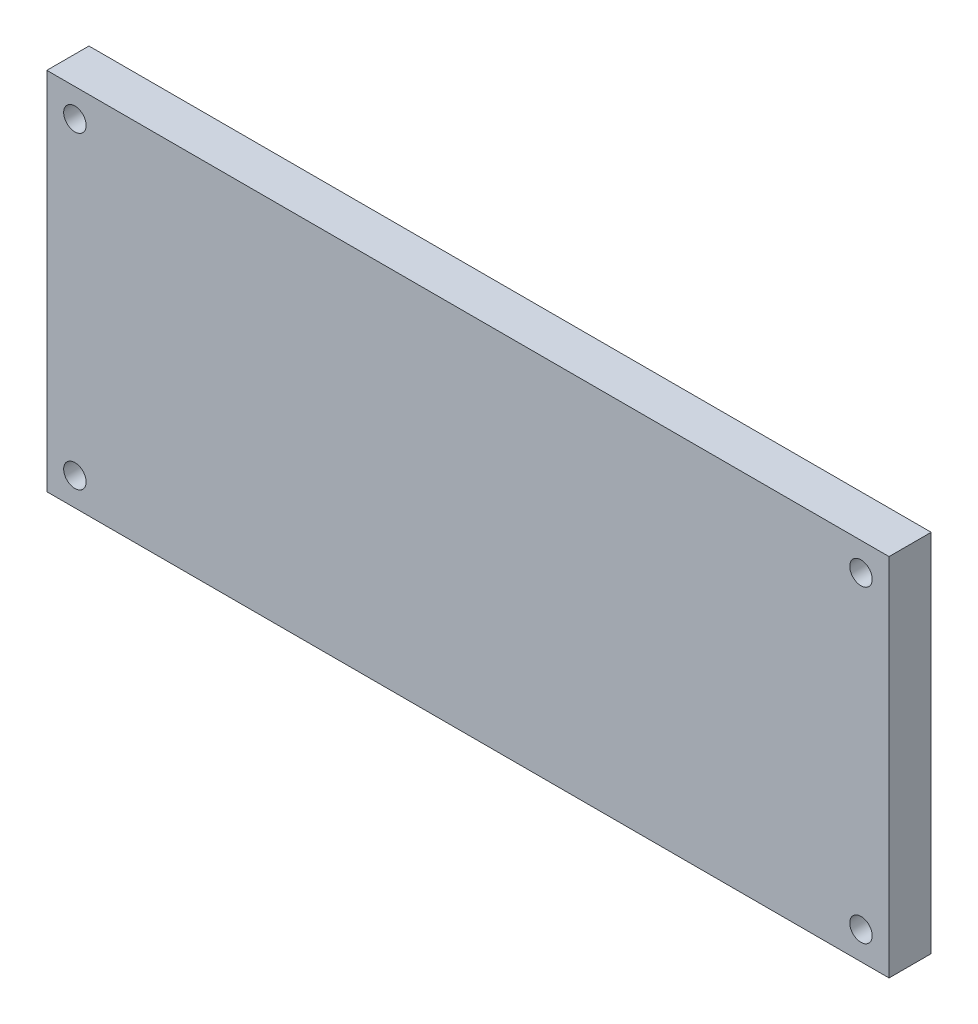
ISO-10303-21;
HEADER;
FILE_DESCRIPTION(('STEP AP214'),'2;1');
FILE_NAME('part.step','',(''),(''),'','','');
FILE_SCHEMA(('AUTOMOTIVE_DESIGN { 1 0 10303 214 1 1 1 1 }'));
ENDSEC;
DATA;
#1=APPLICATION_CONTEXT('core data for automotive mechanical design processes');
#2=APPLICATION_PROTOCOL_DEFINITION('international standard','automotive_design',2000,#1);
#3=PRODUCT_CONTEXT('',#1,'mechanical');
#4=PRODUCT('Part','Part','',(#3));
#5=PRODUCT_RELATED_PRODUCT_CATEGORY('part','',(#4));
#6=PRODUCT_DEFINITION_FORMATION('','',#4);
#7=PRODUCT_DEFINITION_CONTEXT('part definition',#1,'design');
#8=PRODUCT_DEFINITION('design','',#6,#7);
#9=PRODUCT_DEFINITION_SHAPE('','',#8);
#10=(LENGTH_UNIT() NAMED_UNIT(*) SI_UNIT(.MILLI.,.METRE.));
#11=(NAMED_UNIT(*) PLANE_ANGLE_UNIT() SI_UNIT($,.RADIAN.));
#12=(NAMED_UNIT(*) SI_UNIT($,.STERADIAN.) SOLID_ANGLE_UNIT());
#13=UNCERTAINTY_MEASURE_WITH_UNIT(LENGTH_MEASURE(1.E-05),#10,'distance_accuracy_value','');
#14=(GEOMETRIC_REPRESENTATION_CONTEXT(3) GLOBAL_UNCERTAINTY_ASSIGNED_CONTEXT((#13)) GLOBAL_UNIT_ASSIGNED_CONTEXT((#10,
#11,#12)) REPRESENTATION_CONTEXT('',''));
#15=CARTESIAN_POINT('',(0.,0.,0.));
#16=DIRECTION('',(0.,0.,1.));
#17=DIRECTION('',(1.,0.,0.));
#18=AXIS2_PLACEMENT_3D('',#15,#16,#17);
#19=CARTESIAN_POINT('',(-393.802731112973,130.,15.));
#20=DIRECTION('',(1.,0.,0.));
#21=DIRECTION('',(0.,0.,-1.));
#22=AXIS2_PLACEMENT_3D('',#19,#20,#21);
#23=PLANE('',#22);
#24=DIRECTION('',(0.,-1.,0.));
#25=VECTOR('',#24,1.);
#26=CARTESIAN_POINT('',(-393.802731112973,130.,0.));
#27=LINE('',#26,#25);
#28=CARTESIAN_POINT('',(-393.802731112973,130.,0.));
#29=VERTEX_POINT('',#28);
#30=CARTESIAN_POINT('',(-393.802731112973,0.,0.));
#31=VERTEX_POINT('',#30);
#32=EDGE_CURVE('E96',#29,#31,#27,.T.);
#33=ORIENTED_EDGE('',*,*,#32,.T.);
#34=DIRECTION('',(0.,0.,-1.));
#35=VECTOR('',#34,1.);
#36=CARTESIAN_POINT('',(-393.802731112973,0.,15.));
#37=LINE('',#36,#35);
#38=CARTESIAN_POINT('',(-393.802731112973,0.,15.));
#39=VERTEX_POINT('',#38);
#40=EDGE_CURVE('E11',#39,#31,#37,.T.);
#41=ORIENTED_EDGE('',*,*,#40,.F.);
#42=DIRECTION('',(0.,-1.,0.));
#43=VECTOR('',#42,1.);
#44=CARTESIAN_POINT('',(-393.802731112973,130.,15.));
#45=LINE('',#44,#43);
#46=CARTESIAN_POINT('',(-393.802731112973,130.,15.));
#47=VERTEX_POINT('',#46);
#48=EDGE_CURVE('E84',#47,#39,#45,.T.);
#49=ORIENTED_EDGE('',*,*,#48,.F.);
#50=DIRECTION('',(0.,0.,-1.));
#51=VECTOR('',#50,1.);
#52=CARTESIAN_POINT('',(-393.802731112973,130.,15.));
#53=LINE('',#52,#51);
#54=EDGE_CURVE('E92',#47,#29,#53,.T.);
#55=ORIENTED_EDGE('',*,*,#54,.T.);
#56=EDGE_LOOP('',(#33,#41,#49,#55));
#57=FACE_BOUND('',#56,.T.);
#58=ADVANCED_FACE('F33',(#57),#23,.F.);
#59=CARTESIAN_POINT('',(-393.802731112973,0.,15.));
#60=DIRECTION('',(0.,1.,0.));
#61=DIRECTION('',(0.,0.,1.));
#62=AXIS2_PLACEMENT_3D('',#59,#60,#61);
#63=PLANE('',#62);
#64=DIRECTION('',(1.,0.,0.));
#65=VECTOR('',#64,1.);
#66=CARTESIAN_POINT('',(-393.802731112973,0.,0.));
#67=LINE('',#66,#65);
#68=CARTESIAN_POINT('',(-93.8027311129733,0.,0.));
#69=VERTEX_POINT('',#68);
#70=EDGE_CURVE('E88',#31,#69,#67,.T.);
#71=ORIENTED_EDGE('',*,*,#70,.T.);
#72=DIRECTION('',(0.,0.,-1.));
#73=VECTOR('',#72,1.);
#74=CARTESIAN_POINT('',(-93.8027311129733,0.,15.));
#75=LINE('',#74,#73);
#76=CARTESIAN_POINT('',(-93.8027311129733,0.,15.));
#77=VERTEX_POINT('',#76);
#78=EDGE_CURVE('E41',#77,#69,#75,.T.);
#79=ORIENTED_EDGE('',*,*,#78,.F.);
#80=DIRECTION('',(1.,0.,0.));
#81=VECTOR('',#80,1.);
#82=CARTESIAN_POINT('',(-393.802731112973,0.,15.));
#83=LINE('',#82,#81);
#84=EDGE_CURVE('E79',#39,#77,#83,.T.);
#85=ORIENTED_EDGE('',*,*,#84,.F.);
#86=ORIENTED_EDGE('',*,*,#40,.T.);
#87=EDGE_LOOP('',(#71,#79,#85,#86));
#88=FACE_BOUND('',#87,.T.);
#89=ADVANCED_FACE('F87',(#88),#63,.F.);
#90=CARTESIAN_POINT('',(-93.8027311129733,0.,15.));
#91=DIRECTION('',(-1.,0.,0.));
#92=DIRECTION('',(0.,-1.,0.));
#93=AXIS2_PLACEMENT_3D('',#90,#91,#92);
#94=PLANE('',#93);
#95=DIRECTION('',(0.,1.,0.));
#96=VECTOR('',#95,1.);
#97=CARTESIAN_POINT('',(-93.8027311129733,0.,0.));
#98=LINE('',#97,#96);
#99=CARTESIAN_POINT('',(-93.8027311129733,130.,0.));
#100=VERTEX_POINT('',#99);
#101=EDGE_CURVE('E66',#69,#100,#98,.T.);
#102=ORIENTED_EDGE('',*,*,#101,.T.);
#103=DIRECTION('',(0.,0.,-1.));
#104=VECTOR('',#103,1.);
#105=CARTESIAN_POINT('',(-93.8027311129733,130.,15.));
#106=LINE('',#105,#104);
#107=CARTESIAN_POINT('',(-93.8027311129733,130.,15.));
#108=VERTEX_POINT('',#107);
#109=EDGE_CURVE('E89',#108,#100,#106,.T.);
#110=ORIENTED_EDGE('',*,*,#109,.F.);
#111=DIRECTION('',(0.,1.,0.));
#112=VECTOR('',#111,1.);
#113=CARTESIAN_POINT('',(-93.8027311129733,0.,15.));
#114=LINE('',#113,#112);
#115=EDGE_CURVE('E82',#77,#108,#114,.T.);
#116=ORIENTED_EDGE('',*,*,#115,.F.);
#117=ORIENTED_EDGE('',*,*,#78,.T.);
#118=EDGE_LOOP('',(#102,#110,#116,#117));
#119=FACE_BOUND('',#118,.T.);
#120=ADVANCED_FACE('F90',(#119),#94,.F.);
#121=CARTESIAN_POINT('',(-93.8027311129733,130.,15.));
#122=DIRECTION('',(0.,-1.,0.));
#123=DIRECTION('',(0.,0.,-1.));
#124=AXIS2_PLACEMENT_3D('',#121,#122,#123);
#125=PLANE('',#124);
#126=DIRECTION('',(-1.,0.,0.));
#127=VECTOR('',#126,1.);
#128=CARTESIAN_POINT('',(-93.8027311129733,130.,0.));
#129=LINE('',#128,#127);
#130=EDGE_CURVE('E72',#100,#29,#129,.T.);
#131=ORIENTED_EDGE('',*,*,#130,.T.);
#132=ORIENTED_EDGE('',*,*,#54,.F.);
#133=DIRECTION('',(-1.,0.,0.));
#134=VECTOR('',#133,1.);
#135=CARTESIAN_POINT('',(-93.8027311129733,130.,15.));
#136=LINE('',#135,#134);
#137=EDGE_CURVE('E49',#108,#47,#136,.T.);
#138=ORIENTED_EDGE('',*,*,#137,.F.);
#139=ORIENTED_EDGE('',*,*,#109,.T.);
#140=EDGE_LOOP('',(#131,#132,#138,#139));
#141=FACE_BOUND('',#140,.T.);
#142=ADVANCED_FACE('F104',(#141),#125,.F.);
#143=CARTESIAN_POINT('',(0.,0.,15.));
#144=DIRECTION('',(0.,0.,1.));
#145=DIRECTION('',(1.,0.,0.));
#146=AXIS2_PLACEMENT_3D('',#143,#144,#145);
#147=PLANE('',#146);
#148=CARTESIAN_POINT('',(-383.802731112973,9.99999999999999,15.));
#149=DIRECTION('',(0.,0.,-1.));
#150=DIRECTION('',(-1.,0.,0.));
#151=AXIS2_PLACEMENT_3D('',#148,#149,#150);
#152=CIRCLE('',#151,3.99999999999999);
#153=CARTESIAN_POINT('',(-387.802731112973,9.99999999999999,15.));
#154=VERTEX_POINT('',#153);
#155=EDGE_CURVE('E125',#154,#154,#152,.T.);
#156=ORIENTED_EDGE('',*,*,#155,.T.);
#157=EDGE_LOOP('',(#156));
#158=FACE_BOUND('',#157,.T.);
#159=CARTESIAN_POINT('',(-103.802731112973,120.,15.));
#160=DIRECTION('',(0.,0.,-1.));
#161=DIRECTION('',(-1.,0.,0.));
#162=AXIS2_PLACEMENT_3D('',#159,#160,#161);
#163=CIRCLE('',#162,4.00000000000001);
#164=CARTESIAN_POINT('',(-107.802731112973,120.,15.));
#165=VERTEX_POINT('',#164);
#166=EDGE_CURVE('E119',#165,#165,#163,.T.);
#167=ORIENTED_EDGE('',*,*,#166,.T.);
#168=EDGE_LOOP('',(#167));
#169=FACE_BOUND('',#168,.T.);
#170=CARTESIAN_POINT('',(-103.802731112973,10.,15.));
#171=DIRECTION('',(0.,0.,1.));
#172=DIRECTION('',(1.,0.,0.));
#173=AXIS2_PLACEMENT_3D('',#170,#171,#172);
#174=CIRCLE('',#173,4.00000000000001);
#175=CARTESIAN_POINT('',(-99.8027311129733,10.,15.));
#176=VERTEX_POINT('',#175);
#177=EDGE_CURVE('E116',#176,#176,#174,.T.);
#178=ORIENTED_EDGE('',*,*,#177,.F.);
#179=EDGE_LOOP('',(#178));
#180=FACE_BOUND('',#179,.T.);
#181=CARTESIAN_POINT('',(-383.802731112973,120.,15.));
#182=DIRECTION('',(0.,0.,1.));
#183=DIRECTION('',(1.,0.,0.));
#184=AXIS2_PLACEMENT_3D('',#181,#182,#183);
#185=CIRCLE('',#184,3.99999999999999);
#186=CARTESIAN_POINT('',(-379.802731112973,120.,15.));
#187=VERTEX_POINT('',#186);
#188=EDGE_CURVE('E110',#187,#187,#185,.T.);
#189=ORIENTED_EDGE('',*,*,#188,.F.);
#190=EDGE_LOOP('',(#189));
#191=FACE_BOUND('',#190,.T.);
#192=ORIENTED_EDGE('',*,*,#48,.T.);
#193=ORIENTED_EDGE('',*,*,#84,.T.);
#194=ORIENTED_EDGE('',*,*,#115,.T.);
#195=ORIENTED_EDGE('',*,*,#137,.T.);
#196=EDGE_LOOP('',(#192,#193,#194,#195));
#197=FACE_BOUND('',#196,.T.);
#198=ADVANCED_FACE('F80',(#158,#169,#180,#191,#197),#147,.T.);
#199=CARTESIAN_POINT('',(0.,0.,0.));
#200=DIRECTION('',(0.,0.,1.));
#201=DIRECTION('',(1.,0.,0.));
#202=AXIS2_PLACEMENT_3D('',#199,#200,#201);
#203=PLANE('',#202);
#204=CARTESIAN_POINT('',(-383.802731112973,9.99999999999999,0.));
#205=DIRECTION('',(0.,0.,-1.));
#206=DIRECTION('',(-1.,0.,0.));
#207=AXIS2_PLACEMENT_3D('',#204,#205,#206);
#208=CIRCLE('',#207,3.99999999999999);
#209=CARTESIAN_POINT('',(-387.802731112973,9.99999999999999,0.));
#210=VERTEX_POINT('',#209);
#211=EDGE_CURVE('E128',#210,#210,#208,.T.);
#212=ORIENTED_EDGE('',*,*,#211,.F.);
#213=EDGE_LOOP('',(#212));
#214=FACE_BOUND('',#213,.T.);
#215=CARTESIAN_POINT('',(-103.802731112973,120.,0.));
#216=DIRECTION('',(0.,0.,-1.));
#217=DIRECTION('',(-1.,0.,0.));
#218=AXIS2_PLACEMENT_3D('',#215,#216,#217);
#219=CIRCLE('',#218,4.00000000000001);
#220=CARTESIAN_POINT('',(-107.802731112973,120.,0.));
#221=VERTEX_POINT('',#220);
#222=EDGE_CURVE('E122',#221,#221,#219,.T.);
#223=ORIENTED_EDGE('',*,*,#222,.F.);
#224=EDGE_LOOP('',(#223));
#225=FACE_BOUND('',#224,.T.);
#226=CARTESIAN_POINT('',(-103.802731112973,10.,0.));
#227=DIRECTION('',(0.,0.,1.));
#228=DIRECTION('',(1.,0.,0.));
#229=AXIS2_PLACEMENT_3D('',#226,#227,#228);
#230=CIRCLE('',#229,4.00000000000001);
#231=CARTESIAN_POINT('',(-99.8027311129733,10.,0.));
#232=VERTEX_POINT('',#231);
#233=EDGE_CURVE('E113',#232,#232,#230,.T.);
#234=ORIENTED_EDGE('',*,*,#233,.T.);
#235=EDGE_LOOP('',(#234));
#236=FACE_BOUND('',#235,.T.);
#237=CARTESIAN_POINT('',(-383.802731112973,120.,0.));
#238=DIRECTION('',(0.,0.,1.));
#239=DIRECTION('',(1.,0.,0.));
#240=AXIS2_PLACEMENT_3D('',#237,#238,#239);
#241=CIRCLE('',#240,3.99999999999999);
#242=CARTESIAN_POINT('',(-379.802731112973,120.,0.));
#243=VERTEX_POINT('',#242);
#244=EDGE_CURVE('E99',#243,#243,#241,.T.);
#245=ORIENTED_EDGE('',*,*,#244,.T.);
#246=EDGE_LOOP('',(#245));
#247=FACE_BOUND('',#246,.T.);
#248=ORIENTED_EDGE('',*,*,#32,.F.);
#249=ORIENTED_EDGE('',*,*,#130,.F.);
#250=ORIENTED_EDGE('',*,*,#101,.F.);
#251=ORIENTED_EDGE('',*,*,#70,.F.);
#252=EDGE_LOOP('',(#248,#249,#250,#251));
#253=FACE_BOUND('',#252,.T.);
#254=ADVANCED_FACE('F107',(#214,#225,#236,#247,#253),#203,.F.);
#255=CARTESIAN_POINT('',(-383.802731112973,120.,0.));
#256=DIRECTION('',(0.,0.,1.));
#257=DIRECTION('',(1.,0.,0.));
#258=AXIS2_PLACEMENT_3D('',#255,#256,#257);
#259=CYLINDRICAL_SURFACE('',#258,3.99999999999999);
#260=ORIENTED_EDGE('',*,*,#244,.F.);
#261=EDGE_LOOP('',(#260));
#262=FACE_BOUND('',#261,.T.);
#263=ORIENTED_EDGE('',*,*,#188,.T.);
#264=EDGE_LOOP('',(#263));
#265=FACE_BOUND('',#264,.T.);
#266=ADVANCED_FACE('F145',(#262,#265),#259,.F.);
#267=CARTESIAN_POINT('',(-103.802731112973,10.,0.));
#268=DIRECTION('',(0.,0.,1.));
#269=DIRECTION('',(1.,0.,0.));
#270=AXIS2_PLACEMENT_3D('',#267,#268,#269);
#271=CYLINDRICAL_SURFACE('',#270,4.00000000000001);
#272=ORIENTED_EDGE('',*,*,#233,.F.);
#273=EDGE_LOOP('',(#272));
#274=FACE_BOUND('',#273,.T.);
#275=ORIENTED_EDGE('',*,*,#177,.T.);
#276=EDGE_LOOP('',(#275));
#277=FACE_BOUND('',#276,.T.);
#278=ADVANCED_FACE('F155',(#274,#277),#271,.F.);
#279=CARTESIAN_POINT('',(-103.802731112973,120.,15.));
#280=DIRECTION('',(0.,0.,-1.));
#281=DIRECTION('',(-1.,0.,0.));
#282=AXIS2_PLACEMENT_3D('',#279,#280,#281);
#283=CYLINDRICAL_SURFACE('',#282,4.00000000000001);
#284=ORIENTED_EDGE('',*,*,#166,.F.);
#285=EDGE_LOOP('',(#284));
#286=FACE_BOUND('',#285,.T.);
#287=ORIENTED_EDGE('',*,*,#222,.T.);
#288=EDGE_LOOP('',(#287));
#289=FACE_BOUND('',#288,.T.);
#290=ADVANCED_FACE('F139',(#286,#289),#283,.F.);
#291=CARTESIAN_POINT('',(-383.802731112973,9.99999999999999,15.));
#292=DIRECTION('',(0.,0.,-1.));
#293=DIRECTION('',(-1.,0.,0.));
#294=AXIS2_PLACEMENT_3D('',#291,#292,#293);
#295=CYLINDRICAL_SURFACE('',#294,3.99999999999999);
#296=ORIENTED_EDGE('',*,*,#155,.F.);
#297=EDGE_LOOP('',(#296));
#298=FACE_BOUND('',#297,.T.);
#299=ORIENTED_EDGE('',*,*,#211,.T.);
#300=EDGE_LOOP('',(#299));
#301=FACE_BOUND('',#300,.T.);
#302=ADVANCED_FACE('F136',(#298,#301),#295,.F.);
#303=CLOSED_SHELL('',(#58,#89,#120,#142,#198,#254,#266,#278,#290,#302));
#304=MANIFOLD_SOLID_BREP('B2',#303);
#305=ADVANCED_BREP_SHAPE_REPRESENTATION('',(#18,#304),#14);
#306=SHAPE_DEFINITION_REPRESENTATION(#9,#305);
ENDSEC;
END-ISO-10303-21;
